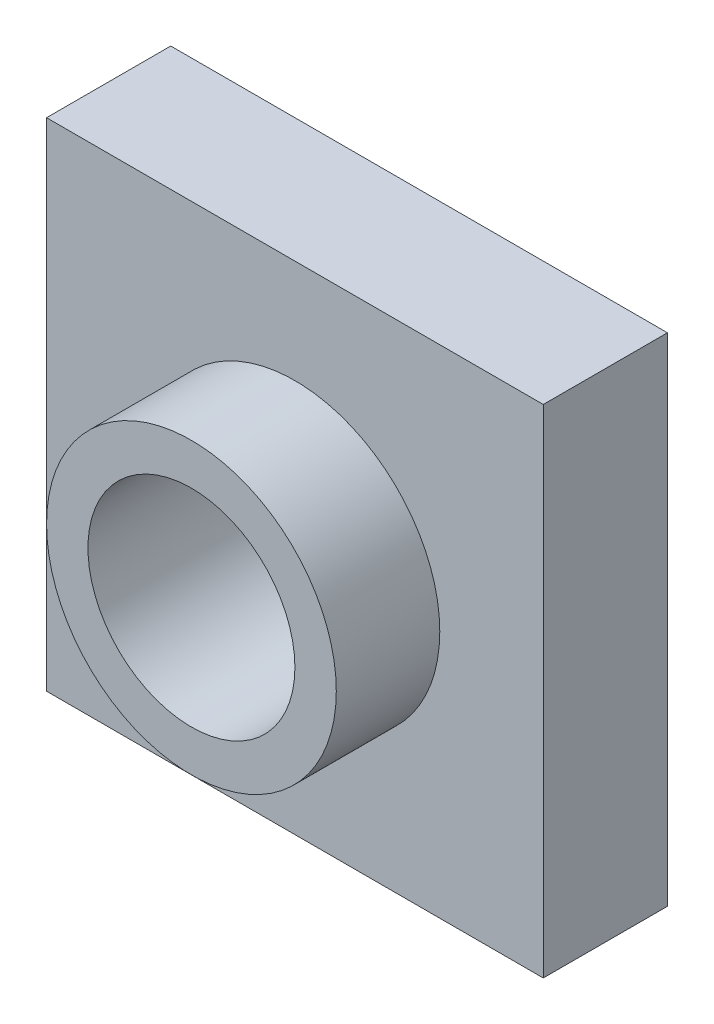
ISO-10303-21;
HEADER;
FILE_DESCRIPTION(('STEP AP214'),'2;1');
FILE_NAME('part.step','',(''),(''),'','','');
FILE_SCHEMA(('AUTOMOTIVE_DESIGN { 1 0 10303 214 1 1 1 1 }'));
ENDSEC;
DATA;
#1=APPLICATION_CONTEXT('core data for automotive mechanical design processes');
#2=APPLICATION_PROTOCOL_DEFINITION('international standard','automotive_design',2000,#1);
#3=PRODUCT_CONTEXT('',#1,'mechanical');
#4=PRODUCT('Part','Part','',(#3));
#5=PRODUCT_RELATED_PRODUCT_CATEGORY('part','',(#4));
#6=PRODUCT_DEFINITION_FORMATION('','',#4);
#7=PRODUCT_DEFINITION_CONTEXT('part definition',#1,'design');
#8=PRODUCT_DEFINITION('design','',#6,#7);
#9=PRODUCT_DEFINITION_SHAPE('','',#8);
#10=(LENGTH_UNIT() NAMED_UNIT(*) SI_UNIT(.MILLI.,.METRE.));
#11=(NAMED_UNIT(*) PLANE_ANGLE_UNIT() SI_UNIT($,.RADIAN.));
#12=(NAMED_UNIT(*) SI_UNIT($,.STERADIAN.) SOLID_ANGLE_UNIT());
#13=UNCERTAINTY_MEASURE_WITH_UNIT(LENGTH_MEASURE(1.E-05),#10,'distance_accuracy_value','');
#14=(GEOMETRIC_REPRESENTATION_CONTEXT(3) GLOBAL_UNCERTAINTY_ASSIGNED_CONTEXT((#13)) GLOBAL_UNIT_ASSIGNED_CONTEXT((#10,
#11,#12)) REPRESENTATION_CONTEXT('',''));
#15=CARTESIAN_POINT('',(0.,0.,0.));
#16=DIRECTION('',(0.,0.,1.));
#17=DIRECTION('',(1.,0.,0.));
#18=AXIS2_PLACEMENT_3D('',#15,#16,#17);
#19=CARTESIAN_POINT('',(0.,0.,30.));
#20=DIRECTION('',(0.,0.,-1.));
#21=DIRECTION('',(-1.,0.,0.));
#22=AXIS2_PLACEMENT_3D('',#19,#20,#21);
#23=PLANE('',#22);
#24=DIRECTION('',(0.,-1.,0.));
#25=VECTOR('',#24,1.);
#26=CARTESIAN_POINT('',(0.,0.,30.));
#27=LINE('',#26,#25);
#28=CARTESIAN_POINT('',(0.,120.,30.));
#29=VERTEX_POINT('',#28);
#30=CARTESIAN_POINT('',(0.,0.,30.));
#31=VERTEX_POINT('',#30);
#32=EDGE_CURVE('E86',#29,#31,#27,.T.);
#33=ORIENTED_EDGE('',*,*,#32,.T.);
#34=DIRECTION('',(1.,0.,0.));
#35=VECTOR('',#34,1.);
#36=CARTESIAN_POINT('',(0.,0.,30.));
#37=LINE('',#36,#35);
#38=CARTESIAN_POINT('',(120.,0.,30.));
#39=VERTEX_POINT('',#38);
#40=EDGE_CURVE('E81',#31,#39,#37,.T.);
#41=ORIENTED_EDGE('',*,*,#40,.T.);
#42=DIRECTION('',(0.,1.,0.));
#43=VECTOR('',#42,1.);
#44=CARTESIAN_POINT('',(120.,0.,30.));
#45=LINE('',#44,#43);
#46=CARTESIAN_POINT('',(120.,120.,30.));
#47=VERTEX_POINT('',#46);
#48=EDGE_CURVE('E84',#39,#47,#45,.T.);
#49=ORIENTED_EDGE('',*,*,#48,.T.);
#50=DIRECTION('',(-1.,0.,0.));
#51=VECTOR('',#50,1.);
#52=CARTESIAN_POINT('',(0.,120.,30.));
#53=LINE('',#52,#51);
#54=EDGE_CURVE('E50',#47,#29,#53,.T.);
#55=ORIENTED_EDGE('',*,*,#54,.T.);
#56=EDGE_LOOP('',(#33,#41,#49,#55));
#57=FACE_BOUND('',#56,.T.);
#58=CARTESIAN_POINT('',(60.,60.,30.));
#59=DIRECTION('',(0.,0.,-1.));
#60=DIRECTION('',(-1.,0.,0.));
#61=AXIS2_PLACEMENT_3D('',#58,#59,#60);
#62=CIRCLE('',#61,35.);
#63=CARTESIAN_POINT('',(25.,60.,30.));
#64=VERTEX_POINT('',#63);
#65=EDGE_CURVE('E11',#64,#64,#62,.F.);
#66=ORIENTED_EDGE('',*,*,#65,.F.);
#67=EDGE_LOOP('',(#66));
#68=FACE_BOUND('',#67,.T.);
#69=ADVANCED_FACE('F33',(#57,#68),#23,.F.);
#70=CARTESIAN_POINT('',(0.,0.,0.));
#71=DIRECTION('',(0.,0.,-1.));
#72=DIRECTION('',(-1.,0.,0.));
#73=AXIS2_PLACEMENT_3D('',#70,#71,#72);
#74=PLANE('',#73);
#75=DIRECTION('',(0.,-1.,0.));
#76=VECTOR('',#75,1.);
#77=CARTESIAN_POINT('',(0.,0.,0.));
#78=LINE('',#77,#76);
#79=CARTESIAN_POINT('',(0.,120.,0.));
#80=VERTEX_POINT('',#79);
#81=CARTESIAN_POINT('',(0.,0.,0.));
#82=VERTEX_POINT('',#81);
#83=EDGE_CURVE('E100',#80,#82,#78,.T.);
#84=ORIENTED_EDGE('',*,*,#83,.F.);
#85=DIRECTION('',(-1.,0.,0.));
#86=VECTOR('',#85,1.);
#87=CARTESIAN_POINT('',(0.,120.,0.));
#88=LINE('',#87,#86);
#89=CARTESIAN_POINT('',(120.,120.,0.));
#90=VERTEX_POINT('',#89);
#91=EDGE_CURVE('E73',#90,#80,#88,.T.);
#92=ORIENTED_EDGE('',*,*,#91,.F.);
#93=DIRECTION('',(0.,1.,0.));
#94=VECTOR('',#93,1.);
#95=CARTESIAN_POINT('',(120.,0.,0.));
#96=LINE('',#95,#94);
#97=CARTESIAN_POINT('',(120.,0.,0.));
#98=VERTEX_POINT('',#97);
#99=EDGE_CURVE('E67',#98,#90,#96,.T.);
#100=ORIENTED_EDGE('',*,*,#99,.F.);
#101=DIRECTION('',(1.,0.,0.));
#102=VECTOR('',#101,1.);
#103=CARTESIAN_POINT('',(0.,0.,0.));
#104=LINE('',#103,#102);
#105=EDGE_CURVE('E91',#82,#98,#104,.T.);
#106=ORIENTED_EDGE('',*,*,#105,.F.);
#107=EDGE_LOOP('',(#84,#92,#100,#106));
#108=FACE_BOUND('',#107,.T.);
#109=CARTESIAN_POINT('',(60.,60.,0.));
#110=DIRECTION('',(0.,0.,1.));
#111=DIRECTION('',(1.,0.,0.));
#112=AXIS2_PLACEMENT_3D('',#109,#110,#111);
#113=CIRCLE('',#112,25.);
#114=CARTESIAN_POINT('',(85.,60.,0.));
#115=VERTEX_POINT('',#114);
#116=EDGE_CURVE('E103',#115,#115,#113,.T.);
#117=ORIENTED_EDGE('',*,*,#116,.T.);
#118=EDGE_LOOP('',(#117));
#119=FACE_BOUND('',#118,.T.);
#120=ADVANCED_FACE('F111',(#108,#119),#74,.T.);
#121=CARTESIAN_POINT('',(0.,0.,30.));
#122=DIRECTION('',(1.,0.,0.));
#123=DIRECTION('',(0.,0.,-1.));
#124=AXIS2_PLACEMENT_3D('',#121,#122,#123);
#125=PLANE('',#124);
#126=ORIENTED_EDGE('',*,*,#83,.T.);
#127=DIRECTION('',(0.,0.,-1.));
#128=VECTOR('',#127,1.);
#129=CARTESIAN_POINT('',(0.,0.,30.));
#130=LINE('',#129,#128);
#131=EDGE_CURVE('E42',#31,#82,#130,.T.);
#132=ORIENTED_EDGE('',*,*,#131,.F.);
#133=ORIENTED_EDGE('',*,*,#32,.F.);
#134=DIRECTION('',(0.,0.,-1.));
#135=VECTOR('',#134,1.);
#136=CARTESIAN_POINT('',(0.,120.,30.));
#137=LINE('',#136,#135);
#138=EDGE_CURVE('E96',#29,#80,#137,.T.);
#139=ORIENTED_EDGE('',*,*,#138,.T.);
#140=EDGE_LOOP('',(#126,#132,#133,#139));
#141=FACE_BOUND('',#140,.T.);
#142=ADVANCED_FACE('F35',(#141),#125,.F.);
#143=CARTESIAN_POINT('',(0.,0.,30.));
#144=DIRECTION('',(0.,1.,0.));
#145=DIRECTION('',(0.,0.,1.));
#146=AXIS2_PLACEMENT_3D('',#143,#144,#145);
#147=PLANE('',#146);
#148=ORIENTED_EDGE('',*,*,#105,.T.);
#149=DIRECTION('',(0.,0.,-1.));
#150=VECTOR('',#149,1.);
#151=CARTESIAN_POINT('',(120.,0.,30.));
#152=LINE('',#151,#150);
#153=EDGE_CURVE('E89',#39,#98,#152,.T.);
#154=ORIENTED_EDGE('',*,*,#153,.F.);
#155=ORIENTED_EDGE('',*,*,#40,.F.);
#156=ORIENTED_EDGE('',*,*,#131,.T.);
#157=EDGE_LOOP('',(#148,#154,#155,#156));
#158=FACE_BOUND('',#157,.T.);
#159=ADVANCED_FACE('F90',(#158),#147,.F.);
#160=CARTESIAN_POINT('',(120.,0.,30.));
#161=DIRECTION('',(-1.,0.,0.));
#162=DIRECTION('',(0.,0.,1.));
#163=AXIS2_PLACEMENT_3D('',#160,#161,#162);
#164=PLANE('',#163);
#165=ORIENTED_EDGE('',*,*,#99,.T.);
#166=DIRECTION('',(0.,0.,-1.));
#167=VECTOR('',#166,1.);
#168=CARTESIAN_POINT('',(120.,120.,30.));
#169=LINE('',#168,#167);
#170=EDGE_CURVE('E92',#47,#90,#169,.T.);
#171=ORIENTED_EDGE('',*,*,#170,.F.);
#172=ORIENTED_EDGE('',*,*,#48,.F.);
#173=ORIENTED_EDGE('',*,*,#153,.T.);
#174=EDGE_LOOP('',(#165,#171,#172,#173));
#175=FACE_BOUND('',#174,.T.);
#176=ADVANCED_FACE('F94',(#175),#164,.F.);
#177=CARTESIAN_POINT('',(0.,120.,30.));
#178=DIRECTION('',(0.,-1.,0.));
#179=DIRECTION('',(0.,0.,-1.));
#180=AXIS2_PLACEMENT_3D('',#177,#178,#179);
#181=PLANE('',#180);
#182=ORIENTED_EDGE('',*,*,#91,.T.);
#183=ORIENTED_EDGE('',*,*,#138,.F.);
#184=ORIENTED_EDGE('',*,*,#54,.F.);
#185=ORIENTED_EDGE('',*,*,#170,.T.);
#186=EDGE_LOOP('',(#182,#183,#184,#185));
#187=FACE_BOUND('',#186,.T.);
#188=ADVANCED_FACE('F140',(#187),#181,.F.);
#189=CARTESIAN_POINT('',(60.,60.,30.));
#190=DIRECTION('',(0.,0.,-1.));
#191=DIRECTION('',(-1.,0.,0.));
#192=AXIS2_PLACEMENT_3D('',#189,#190,#191);
#193=CYLINDRICAL_SURFACE('',#192,25.);
#194=ORIENTED_EDGE('',*,*,#116,.F.);
#195=EDGE_LOOP('',(#194));
#196=FACE_BOUND('',#195,.T.);
#197=CARTESIAN_POINT('',(60.,60.,55.));
#198=DIRECTION('',(0.,0.,1.));
#199=DIRECTION('',(1.,0.,0.));
#200=AXIS2_PLACEMENT_3D('',#197,#198,#199);
#201=CIRCLE('',#200,25.);
#202=CARTESIAN_POINT('',(85.,60.,55.));
#203=VERTEX_POINT('',#202);
#204=EDGE_CURVE('E121',#203,#203,#201,.T.);
#205=ORIENTED_EDGE('',*,*,#204,.T.);
#206=EDGE_LOOP('',(#205));
#207=FACE_BOUND('',#206,.T.);
#208=ADVANCED_FACE('F127',(#196,#207),#193,.F.);
#209=CARTESIAN_POINT('',(60.,60.,55.));
#210=DIRECTION('',(0.,0.,1.));
#211=DIRECTION('',(1.,0.,0.));
#212=AXIS2_PLACEMENT_3D('',#209,#210,#211);
#213=PLANE('',#212);
#214=CARTESIAN_POINT('',(60.,60.,55.));
#215=DIRECTION('',(0.,0.,1.));
#216=DIRECTION('',(1.,0.,0.));
#217=AXIS2_PLACEMENT_3D('',#214,#215,#216);
#218=CIRCLE('',#217,35.);
#219=CARTESIAN_POINT('',(95.,60.,55.));
#220=VERTEX_POINT('',#219);
#221=EDGE_CURVE('E118',#220,#220,#218,.T.);
#222=ORIENTED_EDGE('',*,*,#221,.T.);
#223=EDGE_LOOP('',(#222));
#224=FACE_BOUND('',#223,.T.);
#225=ORIENTED_EDGE('',*,*,#204,.F.);
#226=EDGE_LOOP('',(#225));
#227=FACE_BOUND('',#226,.T.);
#228=ADVANCED_FACE('F129',(#224,#227),#213,.T.);
#229=CARTESIAN_POINT('',(60.,60.,55.));
#230=DIRECTION('',(0.,0.,-1.));
#231=DIRECTION('',(-1.,0.,0.));
#232=AXIS2_PLACEMENT_3D('',#229,#230,#231);
#233=CYLINDRICAL_SURFACE('',#232,35.);
#234=ORIENTED_EDGE('',*,*,#221,.F.);
#235=EDGE_LOOP('',(#234));
#236=FACE_BOUND('',#235,.T.);
#237=ORIENTED_EDGE('',*,*,#65,.T.);
#238=EDGE_LOOP('',(#237));
#239=FACE_BOUND('',#238,.T.);
#240=ADVANCED_FACE('F131',(#236,#239),#233,.T.);
#241=CLOSED_SHELL('',(#69,#120,#142,#159,#176,#188,#208,#228,#240));
#242=MANIFOLD_SOLID_BREP('B2',#241);
#243=ADVANCED_BREP_SHAPE_REPRESENTATION('',(#18,#242),#14);
#244=SHAPE_DEFINITION_REPRESENTATION(#9,#243);
ENDSEC;
END-ISO-10303-21;
